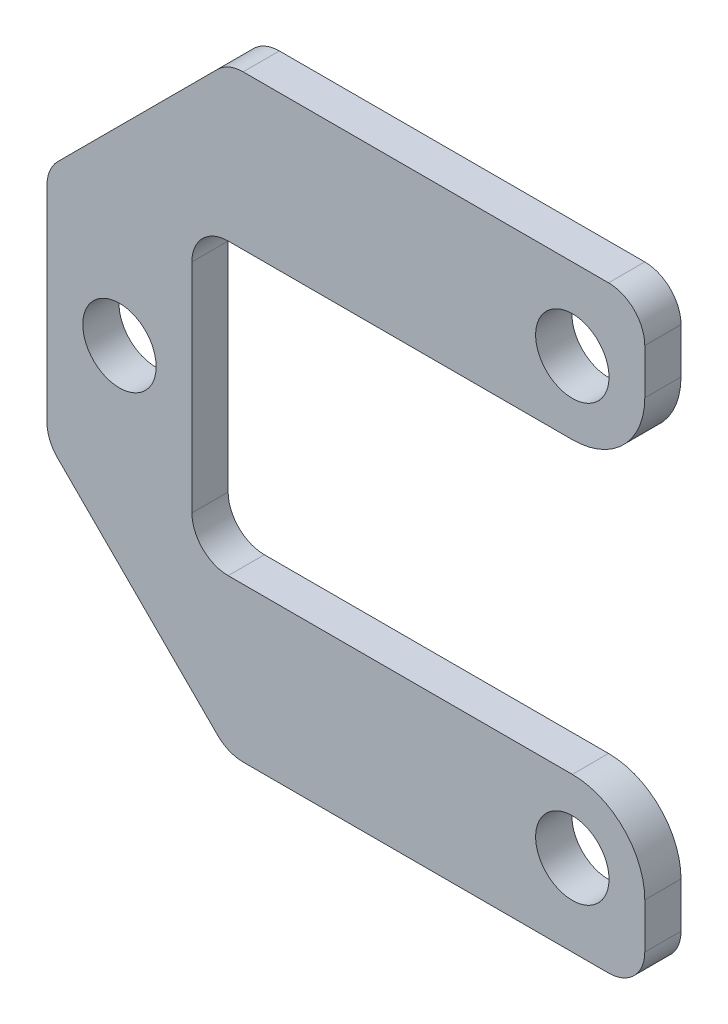
ISO-10303-21;
HEADER;
FILE_DESCRIPTION(('STEP AP214'),'2;1');
FILE_NAME('part.step','',(''),(''),'','','');
FILE_SCHEMA(('AUTOMOTIVE_DESIGN { 1 0 10303 214 1 1 1 1 }'));
ENDSEC;
DATA;
#1=APPLICATION_CONTEXT('core data for automotive mechanical design processes');
#2=APPLICATION_PROTOCOL_DEFINITION('international standard','automotive_design',2000,#1);
#3=PRODUCT_CONTEXT('',#1,'mechanical');
#4=PRODUCT('Part','Part','',(#3));
#5=PRODUCT_RELATED_PRODUCT_CATEGORY('part','',(#4));
#6=PRODUCT_DEFINITION_FORMATION('','',#4);
#7=PRODUCT_DEFINITION_CONTEXT('part definition',#1,'design');
#8=PRODUCT_DEFINITION('design','',#6,#7);
#9=PRODUCT_DEFINITION_SHAPE('','',#8);
#10=(LENGTH_UNIT() NAMED_UNIT(*) SI_UNIT(.MILLI.,.METRE.));
#11=(NAMED_UNIT(*) PLANE_ANGLE_UNIT() SI_UNIT($,.RADIAN.));
#12=(NAMED_UNIT(*) SI_UNIT($,.STERADIAN.) SOLID_ANGLE_UNIT());
#13=UNCERTAINTY_MEASURE_WITH_UNIT(LENGTH_MEASURE(1.E-05),#10,'distance_accuracy_value','');
#14=(GEOMETRIC_REPRESENTATION_CONTEXT(3) GLOBAL_UNCERTAINTY_ASSIGNED_CONTEXT((#13)) GLOBAL_UNIT_ASSIGNED_CONTEXT((#10,
#11,#12)) REPRESENTATION_CONTEXT('',''));
#15=CARTESIAN_POINT('',(0.,0.,0.));
#16=DIRECTION('',(0.,0.,1.));
#17=DIRECTION('',(1.,0.,0.));
#18=AXIS2_PLACEMENT_3D('',#15,#16,#17);
#19=CARTESIAN_POINT('',(19.,-16.5,2.));
#20=DIRECTION('',(-1.,0.,0.));
#21=DIRECTION('',(0.,0.,1.));
#22=AXIS2_PLACEMENT_3D('',#19,#20,#21);
#23=PLANE('',#22);
#24=DIRECTION('',(0.,1.,0.));
#25=VECTOR('',#24,1.);
#26=CARTESIAN_POINT('',(19.,-16.5,0.));
#27=LINE('',#26,#25);
#28=CARTESIAN_POINT('',(19.,-14.5,0.));
#29=VERTEX_POINT('',#28);
#30=CARTESIAN_POINT('',(19.,-12.,0.));
#31=VERTEX_POINT('',#30);
#32=EDGE_CURVE('E196',#29,#31,#27,.T.);
#33=ORIENTED_EDGE('',*,*,#32,.T.);
#34=DIRECTION('',(0.,0.,1.));
#35=VECTOR('',#34,1.);
#36=CARTESIAN_POINT('',(19.,-12.,2.));
#37=LINE('',#36,#35);
#38=CARTESIAN_POINT('',(19.,-12.,2.));
#39=VERTEX_POINT('',#38);
#40=EDGE_CURVE('E200',#31,#39,#37,.T.);
#41=ORIENTED_EDGE('',*,*,#40,.T.);
#42=DIRECTION('',(0.,1.,0.));
#43=VECTOR('',#42,1.);
#44=CARTESIAN_POINT('',(19.,-16.5,2.));
#45=LINE('',#44,#43);
#46=CARTESIAN_POINT('',(19.,-14.5,2.));
#47=VERTEX_POINT('',#46);
#48=EDGE_CURVE('E199',#47,#39,#45,.T.);
#49=ORIENTED_EDGE('',*,*,#48,.F.);
#50=DIRECTION('',(0.,0.,-1.));
#51=VECTOR('',#50,1.);
#52=CARTESIAN_POINT('',(19.,-14.5,2.));
#53=LINE('',#52,#51);
#54=EDGE_CURVE('E183',#47,#29,#53,.T.);
#55=ORIENTED_EDGE('',*,*,#54,.T.);
#56=EDGE_LOOP('',(#33,#41,#49,#55));
#57=FACE_BOUND('',#56,.T.);
#58=ADVANCED_FACE('F39',(#57),#23,.F.);
#59=CARTESIAN_POINT('',(19.,12.,2.));
#60=VERTEX_POINT('',#59);
#61=CARTESIAN_POINT('',(19.,14.5,2.));
#62=VERTEX_POINT('',#61);
#63=EDGE_CURVE('E221',#60,#62,#45,.T.);
#64=ORIENTED_EDGE('',*,*,#63,.F.);
#65=DIRECTION('',(0.,0.,-1.));
#66=VECTOR('',#65,1.);
#67=CARTESIAN_POINT('',(19.,12.,2.));
#68=LINE('',#67,#66);
#69=CARTESIAN_POINT('',(19.,12.,0.));
#70=VERTEX_POINT('',#69);
#71=EDGE_CURVE('E243',#60,#70,#68,.T.);
#72=ORIENTED_EDGE('',*,*,#71,.T.);
#73=CARTESIAN_POINT('',(19.,14.5,0.));
#74=VERTEX_POINT('',#73);
#75=EDGE_CURVE('E209',#70,#74,#27,.T.);
#76=ORIENTED_EDGE('',*,*,#75,.T.);
#77=DIRECTION('',(0.,0.,-1.));
#78=VECTOR('',#77,1.);
#79=CARTESIAN_POINT('',(19.,14.5,2.));
#80=LINE('',#79,#78);
#81=EDGE_CURVE('E241',#74,#62,#80,.F.);
#82=ORIENTED_EDGE('',*,*,#81,.T.);
#83=EDGE_LOOP('',(#64,#72,#76,#82));
#84=FACE_BOUND('',#83,.T.);
#85=ADVANCED_FACE('F384',(#84),#23,.F.);
#86=CARTESIAN_POINT('',(-19.,16.5,2.));
#87=DIRECTION('',(0.,-1.,0.));
#88=DIRECTION('',(0.,0.,-1.));
#89=AXIS2_PLACEMENT_3D('',#86,#87,#88);
#90=PLANE('',#89);
#91=DIRECTION('',(-1.,0.,0.));
#92=VECTOR('',#91,1.);
#93=CARTESIAN_POINT('',(-19.,16.5,0.));
#94=LINE('',#93,#92);
#95=CARTESIAN_POINT('',(17.,16.5,0.));
#96=VERTEX_POINT('',#95);
#97=CARTESIAN_POINT('',(-3.17157287525377,16.5,0.));
#98=VERTEX_POINT('',#97);
#99=EDGE_CURVE('E208',#96,#98,#94,.T.);
#100=ORIENTED_EDGE('',*,*,#99,.T.);
#101=DIRECTION('',(0.,0.,-1.));
#102=VECTOR('',#101,1.);
#103=CARTESIAN_POINT('',(-3.17157287525377,16.5,2.));
#104=LINE('',#103,#102);
#105=CARTESIAN_POINT('',(-3.17157287525377,16.5,2.));
#106=VERTEX_POINT('',#105);
#107=EDGE_CURVE('E304',#98,#106,#104,.F.);
#108=ORIENTED_EDGE('',*,*,#107,.T.);
#109=DIRECTION('',(-1.,0.,0.));
#110=VECTOR('',#109,1.);
#111=CARTESIAN_POINT('',(-19.,16.5,2.));
#112=LINE('',#111,#110);
#113=CARTESIAN_POINT('',(17.,16.5,2.));
#114=VERTEX_POINT('',#113);
#115=EDGE_CURVE('E358',#114,#106,#112,.T.);
#116=ORIENTED_EDGE('',*,*,#115,.F.);
#117=DIRECTION('',(0.,0.,-1.));
#118=VECTOR('',#117,1.);
#119=CARTESIAN_POINT('',(17.,16.5,2.));
#120=LINE('',#119,#118);
#121=EDGE_CURVE('E250',#114,#96,#120,.T.);
#122=ORIENTED_EDGE('',*,*,#121,.T.);
#123=EDGE_LOOP('',(#100,#108,#116,#122));
#124=FACE_BOUND('',#123,.T.);
#125=ADVANCED_FACE('F390',(#124),#90,.F.);
#126=CARTESIAN_POINT('',(-19.,-16.5,2.));
#127=DIRECTION('',(0.,1.,0.));
#128=DIRECTION('',(0.,0.,1.));
#129=AXIS2_PLACEMENT_3D('',#126,#127,#128);
#130=PLANE('',#129);
#131=DIRECTION('',(1.,0.,0.));
#132=VECTOR('',#131,1.);
#133=CARTESIAN_POINT('',(-19.,-16.5,2.));
#134=LINE('',#133,#132);
#135=CARTESIAN_POINT('',(-3.17157287525372,-16.5,2.));
#136=VERTEX_POINT('',#135);
#137=CARTESIAN_POINT('',(17.,-16.5,2.));
#138=VERTEX_POINT('',#137);
#139=EDGE_CURVE('E217',#136,#138,#134,.T.);
#140=ORIENTED_EDGE('',*,*,#139,.F.);
#141=DIRECTION('',(0.,0.,1.));
#142=VECTOR('',#141,1.);
#143=CARTESIAN_POINT('',(-3.17157287525372,-16.5,0.));
#144=LINE('',#143,#142);
#145=CARTESIAN_POINT('',(-3.17157287525372,-16.5,0.));
#146=VERTEX_POINT('',#145);
#147=EDGE_CURVE('E278',#136,#146,#144,.F.);
#148=ORIENTED_EDGE('',*,*,#147,.T.);
#149=DIRECTION('',(1.,0.,0.));
#150=VECTOR('',#149,1.);
#151=CARTESIAN_POINT('',(-19.,-16.5,0.));
#152=LINE('',#151,#150);
#153=CARTESIAN_POINT('',(17.,-16.5,0.));
#154=VERTEX_POINT('',#153);
#155=EDGE_CURVE('E212',#146,#154,#152,.T.);
#156=ORIENTED_EDGE('',*,*,#155,.T.);
#157=DIRECTION('',(0.,0.,-1.));
#158=VECTOR('',#157,1.);
#159=CARTESIAN_POINT('',(17.,-16.5,2.));
#160=LINE('',#159,#158);
#161=EDGE_CURVE('E185',#154,#138,#160,.F.);
#162=ORIENTED_EDGE('',*,*,#161,.T.);
#163=EDGE_LOOP('',(#140,#148,#156,#162));
#164=FACE_BOUND('',#163,.T.);
#165=ADVANCED_FACE('F365',(#164),#130,.F.);
#166=CARTESIAN_POINT('',(0.,0.,2.));
#167=DIRECTION('',(0.,0.,-1.));
#168=DIRECTION('',(-1.,0.,0.));
#169=AXIS2_PLACEMENT_3D('',#166,#167,#168);
#170=PLANE('',#169);
#171=CARTESIAN_POINT('',(-9.99999999999996,0.,2.));
#172=DIRECTION('',(0.,0.,1.));
#173=DIRECTION('',(1.,0.,0.));
#174=AXIS2_PLACEMENT_3D('',#171,#172,#173);
#175=CIRCLE('',#174,2.025);
#176=CARTESIAN_POINT('',(-7.97499999999996,0.,2.));
#177=VERTEX_POINT('',#176);
#178=EDGE_CURVE('E343',#177,#177,#175,.T.);
#179=ORIENTED_EDGE('',*,*,#178,.F.);
#180=EDGE_LOOP('',(#179));
#181=FACE_BOUND('',#180,.T.);
#182=CARTESIAN_POINT('',(15.,-12.,2.));
#183=DIRECTION('',(0.,0.,1.));
#184=DIRECTION('',(1.,0.,0.));
#185=AXIS2_PLACEMENT_3D('',#182,#183,#184);
#186=CIRCLE('',#185,2.025);
#187=CARTESIAN_POINT('',(17.025,-12.,2.));
#188=VERTEX_POINT('',#187);
#189=EDGE_CURVE('E349',#188,#188,#186,.T.);
#190=ORIENTED_EDGE('',*,*,#189,.F.);
#191=EDGE_LOOP('',(#190));
#192=FACE_BOUND('',#191,.T.);
#193=CARTESIAN_POINT('',(15.,12.,2.));
#194=DIRECTION('',(0.,0.,1.));
#195=DIRECTION('',(1.,0.,0.));
#196=AXIS2_PLACEMENT_3D('',#193,#194,#195);
#197=CIRCLE('',#196,2.025);
#198=CARTESIAN_POINT('',(17.025,12.,2.));
#199=VERTEX_POINT('',#198);
#200=EDGE_CURVE('E335',#199,#199,#197,.T.);
#201=ORIENTED_EDGE('',*,*,#200,.F.);
#202=EDGE_LOOP('',(#201));
#203=FACE_BOUND('',#202,.T.);
#204=DIRECTION('',(-0.707106781186549,0.707106781186546,0.));
#205=VECTOR('',#204,1.);
#206=CARTESIAN_POINT('',(-14.,-6.49999999999996,2.));
#207=LINE('',#206,#205);
#208=CARTESIAN_POINT('',(-13.414213562373,-7.08578643762686,2.));
#209=VERTEX_POINT('',#208);
#210=CARTESIAN_POINT('',(-4.58578643762681,-15.9142135623731,2.));
#211=VERTEX_POINT('',#210);
#212=EDGE_CURVE('E267',#209,#211,#207,.F.);
#213=ORIENTED_EDGE('',*,*,#212,.T.);
#214=CARTESIAN_POINT('',(-3.17157287525372,-14.5,2.));
#215=DIRECTION('',(0.,0.,-1.));
#216=DIRECTION('',(-1.,0.,0.));
#217=AXIS2_PLACEMENT_3D('',#214,#215,#216);
#218=CIRCLE('',#217,2.);
#219=EDGE_CURVE('E297',#211,#136,#218,.F.);
#220=ORIENTED_EDGE('',*,*,#219,.T.);
#221=ORIENTED_EDGE('',*,*,#139,.T.);
#222=CARTESIAN_POINT('',(17.,-14.5,2.));
#223=DIRECTION('',(0.,0.,-1.));
#224=DIRECTION('',(-1.,0.,0.));
#225=AXIS2_PLACEMENT_3D('',#222,#223,#224);
#226=CIRCLE('',#225,2.);
#227=EDGE_CURVE('E225',#138,#47,#226,.F.);
#228=ORIENTED_EDGE('',*,*,#227,.T.);
#229=ORIENTED_EDGE('',*,*,#48,.T.);
#230=CARTESIAN_POINT('',(15.,-12.,2.));
#231=DIRECTION('',(0.,0.,-1.));
#232=DIRECTION('',(-1.,0.,0.));
#233=AXIS2_PLACEMENT_3D('',#230,#231,#232);
#234=CIRCLE('',#233,4.);
#235=CARTESIAN_POINT('',(15.,-7.99999999999999,2.));
#236=VERTEX_POINT('',#235);
#237=EDGE_CURVE('E231',#39,#236,#234,.F.);
#238=ORIENTED_EDGE('',*,*,#237,.T.);
#239=DIRECTION('',(1.,0.,0.));
#240=VECTOR('',#239,1.);
#241=CARTESIAN_POINT('',(-5.99999999999996,-7.99999999999999,2.));
#242=LINE('',#241,#240);
#243=CARTESIAN_POINT('',(-3.99999999999996,-7.99999999999999,2.));
#244=VERTEX_POINT('',#243);
#245=EDGE_CURVE('E334',#244,#236,#242,.T.);
#246=ORIENTED_EDGE('',*,*,#245,.F.);
#247=CARTESIAN_POINT('',(-3.99999999999996,-5.99999999999999,2.));
#248=DIRECTION('',(0.,0.,-1.));
#249=DIRECTION('',(-1.,0.,0.));
#250=AXIS2_PLACEMENT_3D('',#247,#248,#249);
#251=CIRCLE('',#250,2.);
#252=CARTESIAN_POINT('',(-5.99999999999996,-5.99999999999999,2.));
#253=VERTEX_POINT('',#252);
#254=EDGE_CURVE('E263',#244,#253,#251,.T.);
#255=ORIENTED_EDGE('',*,*,#254,.T.);
#256=DIRECTION('',(0.,-1.,0.));
#257=VECTOR('',#256,1.);
#258=CARTESIAN_POINT('',(-5.99999999999996,-7.99999999999999,2.));
#259=LINE('',#258,#257);
#260=CARTESIAN_POINT('',(-5.99999999999996,5.99999999999999,2.));
#261=VERTEX_POINT('',#260);
#262=EDGE_CURVE('E326',#261,#253,#259,.T.);
#263=ORIENTED_EDGE('',*,*,#262,.F.);
#264=CARTESIAN_POINT('',(-3.99999999999996,5.99999999999999,2.));
#265=DIRECTION('',(0.,0.,-1.));
#266=DIRECTION('',(-1.,0.,0.));
#267=AXIS2_PLACEMENT_3D('',#264,#265,#266);
#268=CIRCLE('',#267,2.);
#269=CARTESIAN_POINT('',(-3.99999999999996,7.99999999999999,2.));
#270=VERTEX_POINT('',#269);
#271=EDGE_CURVE('E259',#261,#270,#268,.T.);
#272=ORIENTED_EDGE('',*,*,#271,.T.);
#273=DIRECTION('',(-1.,0.,0.));
#274=VECTOR('',#273,1.);
#275=CARTESIAN_POINT('',(-5.99999999999996,7.99999999999999,2.));
#276=LINE('',#275,#274);
#277=CARTESIAN_POINT('',(15.,7.99999999999999,2.));
#278=VERTEX_POINT('',#277);
#279=EDGE_CURVE('E323',#278,#270,#276,.T.);
#280=ORIENTED_EDGE('',*,*,#279,.F.);
#281=CARTESIAN_POINT('',(15.,12.,2.));
#282=DIRECTION('',(0.,0.,-1.));
#283=DIRECTION('',(-1.,0.,0.));
#284=AXIS2_PLACEMENT_3D('',#281,#282,#283);
#285=CIRCLE('',#284,4.);
#286=EDGE_CURVE('E229',#278,#60,#285,.F.);
#287=ORIENTED_EDGE('',*,*,#286,.T.);
#288=ORIENTED_EDGE('',*,*,#63,.T.);
#289=CARTESIAN_POINT('',(17.,14.5,2.));
#290=DIRECTION('',(0.,0.,-1.));
#291=DIRECTION('',(-1.,0.,0.));
#292=AXIS2_PLACEMENT_3D('',#289,#290,#291);
#293=CIRCLE('',#292,2.);
#294=EDGE_CURVE('E227',#62,#114,#293,.F.);
#295=ORIENTED_EDGE('',*,*,#294,.T.);
#296=ORIENTED_EDGE('',*,*,#115,.T.);
#297=CARTESIAN_POINT('',(-3.17157287525377,14.5,2.));
#298=DIRECTION('',(0.,0.,-1.));
#299=DIRECTION('',(-1.,0.,0.));
#300=AXIS2_PLACEMENT_3D('',#297,#298,#299);
#301=CIRCLE('',#300,2.);
#302=CARTESIAN_POINT('',(-4.58578643762687,15.9142135623731,2.));
#303=VERTEX_POINT('',#302);
#304=EDGE_CURVE('E294',#106,#303,#301,.F.);
#305=ORIENTED_EDGE('',*,*,#304,.T.);
#306=DIRECTION('',(0.707106781186546,0.707106781186549,0.));
#307=VECTOR('',#306,1.);
#308=CARTESIAN_POINT('',(-3.99999999999997,16.5,2.));
#309=LINE('',#308,#307);
#310=CARTESIAN_POINT('',(-13.4142135623731,7.08578643762689,2.));
#311=VERTEX_POINT('',#310);
#312=EDGE_CURVE('E270',#303,#311,#309,.F.);
#313=ORIENTED_EDGE('',*,*,#312,.T.);
#314=CARTESIAN_POINT('',(-12.,5.6715728752538,2.));
#315=DIRECTION('',(0.,0.,-1.));
#316=DIRECTION('',(-1.,0.,0.));
#317=AXIS2_PLACEMENT_3D('',#314,#315,#316);
#318=CIRCLE('',#317,2.);
#319=CARTESIAN_POINT('',(-14.,5.6715728752538,2.));
#320=VERTEX_POINT('',#319);
#321=EDGE_CURVE('E54',#311,#320,#318,.F.);
#322=ORIENTED_EDGE('',*,*,#321,.T.);
#323=DIRECTION('',(0.,1.,0.));
#324=VECTOR('',#323,1.);
#325=CARTESIAN_POINT('',(-14.,16.5,2.));
#326=LINE('',#325,#324);
#327=CARTESIAN_POINT('',(-14.,-5.67157287525377,2.));
#328=VERTEX_POINT('',#327);
#329=EDGE_CURVE('E321',#328,#320,#326,.T.);
#330=ORIENTED_EDGE('',*,*,#329,.F.);
#331=CARTESIAN_POINT('',(-12.,-5.67157287525377,2.));
#332=DIRECTION('',(0.,0.,-1.));
#333=DIRECTION('',(-1.,0.,0.));
#334=AXIS2_PLACEMENT_3D('',#331,#332,#333);
#335=CIRCLE('',#334,2.);
#336=EDGE_CURVE('E62',#328,#209,#335,.F.);
#337=ORIENTED_EDGE('',*,*,#336,.T.);
#338=EDGE_LOOP('',(#213,#220,#221,#228,#229,#238,#246,#255,#263,#272,#280,#287,#288,#295,#296,
#305,#313,#322,#330,#337));
#339=FACE_BOUND('',#338,.T.);
#340=ADVANCED_FACE('F313',(#181,#192,#203,#339),#170,.F.);
#341=CARTESIAN_POINT('',(0.,0.,0.));
#342=DIRECTION('',(0.,0.,-1.));
#343=DIRECTION('',(-1.,0.,0.));
#344=AXIS2_PLACEMENT_3D('',#341,#342,#343);
#345=PLANE('',#344);
#346=ORIENTED_EDGE('',*,*,#155,.F.);
#347=CARTESIAN_POINT('',(-3.17157287525372,-14.5,0.));
#348=DIRECTION('',(0.,0.,-1.));
#349=DIRECTION('',(-1.,0.,0.));
#350=AXIS2_PLACEMENT_3D('',#347,#348,#349);
#351=CIRCLE('',#350,2.);
#352=CARTESIAN_POINT('',(-4.58578643762681,-15.9142135623731,0.));
#353=VERTEX_POINT('',#352);
#354=EDGE_CURVE('E287',#146,#353,#351,.T.);
#355=ORIENTED_EDGE('',*,*,#354,.T.);
#356=DIRECTION('',(0.707106781186549,-0.707106781186546,0.));
#357=VECTOR('',#356,1.);
#358=CARTESIAN_POINT('',(-10.2499999999999,-10.25,0.));
#359=LINE('',#358,#357);
#360=CARTESIAN_POINT('',(-13.414213562373,-7.08578643762687,0.));
#361=VERTEX_POINT('',#360);
#362=EDGE_CURVE('E272',#353,#361,#359,.F.);
#363=ORIENTED_EDGE('',*,*,#362,.T.);
#364=CARTESIAN_POINT('',(-12.,-5.67157287525377,0.));
#365=DIRECTION('',(0.,0.,-1.));
#366=DIRECTION('',(-1.,0.,0.));
#367=AXIS2_PLACEMENT_3D('',#364,#365,#366);
#368=CIRCLE('',#367,2.);
#369=CARTESIAN_POINT('',(-14.,-5.67157287525377,0.));
#370=VERTEX_POINT('',#369);
#371=EDGE_CURVE('E285',#361,#370,#368,.T.);
#372=ORIENTED_EDGE('',*,*,#371,.T.);
#373=DIRECTION('',(0.,1.,0.));
#374=VECTOR('',#373,1.);
#375=CARTESIAN_POINT('',(-14.,16.5,0.));
#376=LINE('',#375,#374);
#377=CARTESIAN_POINT('',(-14.,5.6715728752538,0.));
#378=VERTEX_POINT('',#377);
#379=EDGE_CURVE('E320',#370,#378,#376,.T.);
#380=ORIENTED_EDGE('',*,*,#379,.T.);
#381=CARTESIAN_POINT('',(-12.,5.6715728752538,0.));
#382=DIRECTION('',(0.,0.,-1.));
#383=DIRECTION('',(-1.,0.,0.));
#384=AXIS2_PLACEMENT_3D('',#381,#382,#383);
#385=CIRCLE('',#384,2.);
#386=CARTESIAN_POINT('',(-13.4142135623731,7.0857864376269,0.));
#387=VERTEX_POINT('',#386);
#388=EDGE_CURVE('E281',#378,#387,#385,.T.);
#389=ORIENTED_EDGE('',*,*,#388,.T.);
#390=DIRECTION('',(-0.707106781186546,-0.707106781186549,0.));
#391=VECTOR('',#390,1.);
#392=CARTESIAN_POINT('',(-10.25,10.25,0.));
#393=LINE('',#392,#391);
#394=CARTESIAN_POINT('',(-4.58578643762687,15.9142135623731,0.));
#395=VERTEX_POINT('',#394);
#396=EDGE_CURVE('E275',#387,#395,#393,.F.);
#397=ORIENTED_EDGE('',*,*,#396,.T.);
#398=CARTESIAN_POINT('',(-3.17157287525377,14.5,0.));
#399=DIRECTION('',(0.,0.,-1.));
#400=DIRECTION('',(-1.,0.,0.));
#401=AXIS2_PLACEMENT_3D('',#398,#399,#400);
#402=CIRCLE('',#401,2.);
#403=EDGE_CURVE('E283',#395,#98,#402,.T.);
#404=ORIENTED_EDGE('',*,*,#403,.T.);
#405=ORIENTED_EDGE('',*,*,#99,.F.);
#406=CARTESIAN_POINT('',(17.,14.5,0.));
#407=DIRECTION('',(0.,0.,-1.));
#408=DIRECTION('',(-1.,0.,0.));
#409=AXIS2_PLACEMENT_3D('',#406,#407,#408);
#410=CIRCLE('',#409,2.);
#411=EDGE_CURVE('E189',#96,#74,#410,.T.);
#412=ORIENTED_EDGE('',*,*,#411,.T.);
#413=ORIENTED_EDGE('',*,*,#75,.F.);
#414=CARTESIAN_POINT('',(15.,12.,0.));
#415=DIRECTION('',(0.,0.,-1.));
#416=DIRECTION('',(-1.,0.,0.));
#417=AXIS2_PLACEMENT_3D('',#414,#415,#416);
#418=CIRCLE('',#417,4.);
#419=CARTESIAN_POINT('',(15.,7.99999999999999,0.));
#420=VERTEX_POINT('',#419);
#421=EDGE_CURVE('E238',#70,#420,#418,.T.);
#422=ORIENTED_EDGE('',*,*,#421,.T.);
#423=DIRECTION('',(1.,0.,0.));
#424=VECTOR('',#423,1.);
#425=CARTESIAN_POINT('',(0.,7.99999999999999,0.));
#426=LINE('',#425,#424);
#427=CARTESIAN_POINT('',(-3.99999999999996,7.99999999999999,0.));
#428=VERTEX_POINT('',#427);
#429=EDGE_CURVE('E201',#428,#420,#426,.T.);
#430=ORIENTED_EDGE('',*,*,#429,.F.);
#431=CARTESIAN_POINT('',(-3.99999999999996,5.99999999999999,0.));
#432=DIRECTION('',(0.,0.,-1.));
#433=DIRECTION('',(-1.,0.,0.));
#434=AXIS2_PLACEMENT_3D('',#431,#432,#433);
#435=CIRCLE('',#434,2.);
#436=CARTESIAN_POINT('',(-5.99999999999996,5.99999999999999,0.));
#437=VERTEX_POINT('',#436);
#438=EDGE_CURVE('E261',#428,#437,#435,.F.);
#439=ORIENTED_EDGE('',*,*,#438,.T.);
#440=DIRECTION('',(0.,-1.,0.));
#441=VECTOR('',#440,1.);
#442=CARTESIAN_POINT('',(-5.99999999999996,-7.99999999999999,0.));
#443=LINE('',#442,#441);
#444=CARTESIAN_POINT('',(-5.99999999999996,-5.99999999999999,0.));
#445=VERTEX_POINT('',#444);
#446=EDGE_CURVE('E330',#437,#445,#443,.T.);
#447=ORIENTED_EDGE('',*,*,#446,.T.);
#448=CARTESIAN_POINT('',(-3.99999999999996,-5.99999999999999,0.));
#449=DIRECTION('',(0.,0.,-1.));
#450=DIRECTION('',(-1.,0.,0.));
#451=AXIS2_PLACEMENT_3D('',#448,#449,#450);
#452=CIRCLE('',#451,2.);
#453=CARTESIAN_POINT('',(-3.99999999999996,-7.99999999999999,0.));
#454=VERTEX_POINT('',#453);
#455=EDGE_CURVE('E265',#445,#454,#452,.F.);
#456=ORIENTED_EDGE('',*,*,#455,.T.);
#457=DIRECTION('',(1.,0.,0.));
#458=VECTOR('',#457,1.);
#459=CARTESIAN_POINT('',(-5.99999999999996,-7.99999999999999,0.));
#460=LINE('',#459,#458);
#461=CARTESIAN_POINT('',(15.,-7.99999999999999,0.));
#462=VERTEX_POINT('',#461);
#463=EDGE_CURVE('E333',#454,#462,#460,.T.);
#464=ORIENTED_EDGE('',*,*,#463,.T.);
#465=CARTESIAN_POINT('',(15.,-12.,0.));
#466=DIRECTION('',(0.,0.,-1.));
#467=DIRECTION('',(-1.,0.,0.));
#468=AXIS2_PLACEMENT_3D('',#465,#466,#467);
#469=CIRCLE('',#468,4.);
#470=EDGE_CURVE('E207',#462,#31,#469,.T.);
#471=ORIENTED_EDGE('',*,*,#470,.T.);
#472=ORIENTED_EDGE('',*,*,#32,.F.);
#473=CARTESIAN_POINT('',(17.,-14.5,0.));
#474=DIRECTION('',(0.,0.,-1.));
#475=DIRECTION('',(-1.,0.,0.));
#476=AXIS2_PLACEMENT_3D('',#473,#474,#475);
#477=CIRCLE('',#476,2.);
#478=EDGE_CURVE('E179',#29,#154,#477,.T.);
#479=ORIENTED_EDGE('',*,*,#478,.T.);
#480=EDGE_LOOP('',(#346,#355,#363,#372,#380,#389,#397,#404,#405,#412,#413,#422,#430,#439,#447,
#456,#464,#471,#472,#479));
#481=FACE_BOUND('',#480,.T.);
#482=CARTESIAN_POINT('',(-9.99999999999996,0.,0.));
#483=DIRECTION('',(0.,0.,1.));
#484=DIRECTION('',(1.,0.,0.));
#485=AXIS2_PLACEMENT_3D('',#482,#483,#484);
#486=CIRCLE('',#485,2.025);
#487=CARTESIAN_POINT('',(-7.97499999999996,0.,0.));
#488=VERTEX_POINT('',#487);
#489=EDGE_CURVE('E215',#488,#488,#486,.T.);
#490=ORIENTED_EDGE('',*,*,#489,.T.);
#491=EDGE_LOOP('',(#490));
#492=FACE_BOUND('',#491,.T.);
#493=CARTESIAN_POINT('',(15.,-12.,0.));
#494=DIRECTION('',(0.,0.,1.));
#495=DIRECTION('',(1.,0.,0.));
#496=AXIS2_PLACEMENT_3D('',#493,#494,#495);
#497=CIRCLE('',#496,2.025);
#498=CARTESIAN_POINT('',(17.025,-12.,0.));
#499=VERTEX_POINT('',#498);
#500=EDGE_CURVE('E346',#499,#499,#497,.T.);
#501=ORIENTED_EDGE('',*,*,#500,.T.);
#502=EDGE_LOOP('',(#501));
#503=FACE_BOUND('',#502,.T.);
#504=CARTESIAN_POINT('',(15.,12.,0.));
#505=DIRECTION('',(0.,0.,1.));
#506=DIRECTION('',(1.,0.,0.));
#507=AXIS2_PLACEMENT_3D('',#504,#505,#506);
#508=CIRCLE('',#507,2.025);
#509=CARTESIAN_POINT('',(17.025,12.,0.));
#510=VERTEX_POINT('',#509);
#511=EDGE_CURVE('E352',#510,#510,#508,.T.);
#512=ORIENTED_EDGE('',*,*,#511,.T.);
#513=EDGE_LOOP('',(#512));
#514=FACE_BOUND('',#513,.T.);
#515=ADVANCED_FACE('F203',(#481,#492,#503,#514),#345,.T.);
#516=CARTESIAN_POINT('',(15.,12.,0.));
#517=DIRECTION('',(0.,0.,1.));
#518=DIRECTION('',(1.,0.,0.));
#519=AXIS2_PLACEMENT_3D('',#516,#517,#518);
#520=CYLINDRICAL_SURFACE('',#519,2.025);
#521=ORIENTED_EDGE('',*,*,#511,.F.);
#522=EDGE_LOOP('',(#521));
#523=FACE_BOUND('',#522,.T.);
#524=ORIENTED_EDGE('',*,*,#200,.T.);
#525=EDGE_LOOP('',(#524));
#526=FACE_BOUND('',#525,.T.);
#527=ADVANCED_FACE('F450',(#523,#526),#520,.F.);
#528=CARTESIAN_POINT('',(15.,-12.,0.));
#529=DIRECTION('',(0.,0.,1.));
#530=DIRECTION('',(1.,0.,0.));
#531=AXIS2_PLACEMENT_3D('',#528,#529,#530);
#532=CYLINDRICAL_SURFACE('',#531,2.025);
#533=ORIENTED_EDGE('',*,*,#500,.F.);
#534=EDGE_LOOP('',(#533));
#535=FACE_BOUND('',#534,.T.);
#536=ORIENTED_EDGE('',*,*,#189,.T.);
#537=EDGE_LOOP('',(#536));
#538=FACE_BOUND('',#537,.T.);
#539=ADVANCED_FACE('F446',(#535,#538),#532,.F.);
#540=CARTESIAN_POINT('',(-9.99999999999996,0.,0.));
#541=DIRECTION('',(0.,0.,1.));
#542=DIRECTION('',(1.,0.,0.));
#543=AXIS2_PLACEMENT_3D('',#540,#541,#542);
#544=CYLINDRICAL_SURFACE('',#543,2.025);
#545=ORIENTED_EDGE('',*,*,#489,.F.);
#546=EDGE_LOOP('',(#545));
#547=FACE_BOUND('',#546,.T.);
#548=ORIENTED_EDGE('',*,*,#178,.T.);
#549=EDGE_LOOP('',(#548));
#550=FACE_BOUND('',#549,.T.);
#551=ADVANCED_FACE('F436',(#547,#550),#544,.F.);
#552=CARTESIAN_POINT('',(-5.99999999999996,-7.99999999999999,0.));
#553=DIRECTION('',(0.,-1.,0.));
#554=DIRECTION('',(0.,0.,-1.));
#555=AXIS2_PLACEMENT_3D('',#552,#553,#554);
#556=PLANE('',#555);
#557=ORIENTED_EDGE('',*,*,#245,.T.);
#558=DIRECTION('',(0.,0.,1.));
#559=VECTOR('',#558,1.);
#560=CARTESIAN_POINT('',(15.,-7.99999999999999,0.));
#561=LINE('',#560,#559);
#562=EDGE_CURVE('E190',#236,#462,#561,.F.);
#563=ORIENTED_EDGE('',*,*,#562,.T.);
#564=ORIENTED_EDGE('',*,*,#463,.F.);
#565=DIRECTION('',(0.,0.,1.));
#566=VECTOR('',#565,1.);
#567=CARTESIAN_POINT('',(-3.99999999999996,-7.99999999999999,2.));
#568=LINE('',#567,#566);
#569=EDGE_CURVE('E233',#454,#244,#568,.T.);
#570=ORIENTED_EDGE('',*,*,#569,.T.);
#571=EDGE_LOOP('',(#557,#563,#564,#570));
#572=FACE_BOUND('',#571,.T.);
#573=ADVANCED_FACE('F432',(#572),#556,.F.);
#574=CARTESIAN_POINT('',(-5.99999999999996,7.99999999999999,0.));
#575=DIRECTION('',(0.,1.,0.));
#576=DIRECTION('',(0.,0.,1.));
#577=AXIS2_PLACEMENT_3D('',#574,#575,#576);
#578=PLANE('',#577);
#579=ORIENTED_EDGE('',*,*,#429,.T.);
#580=DIRECTION('',(0.,0.,-1.));
#581=VECTOR('',#580,1.);
#582=CARTESIAN_POINT('',(15.,7.99999999999999,0.));
#583=LINE('',#582,#581);
#584=EDGE_CURVE('E248',#420,#278,#583,.F.);
#585=ORIENTED_EDGE('',*,*,#584,.T.);
#586=ORIENTED_EDGE('',*,*,#279,.T.);
#587=DIRECTION('',(0.,0.,1.));
#588=VECTOR('',#587,1.);
#589=CARTESIAN_POINT('',(-3.99999999999996,7.99999999999999,0.));
#590=LINE('',#589,#588);
#591=EDGE_CURVE('E246',#270,#428,#590,.F.);
#592=ORIENTED_EDGE('',*,*,#591,.T.);
#593=EDGE_LOOP('',(#579,#585,#586,#592));
#594=FACE_BOUND('',#593,.T.);
#595=ADVANCED_FACE('F435',(#594),#578,.F.);
#596=CARTESIAN_POINT('',(-5.99999999999996,-7.99999999999999,0.));
#597=DIRECTION('',(-1.,0.,0.));
#598=DIRECTION('',(0.,0.,1.));
#599=AXIS2_PLACEMENT_3D('',#596,#597,#598);
#600=PLANE('',#599);
#601=ORIENTED_EDGE('',*,*,#446,.F.);
#602=DIRECTION('',(0.,0.,1.));
#603=VECTOR('',#602,1.);
#604=CARTESIAN_POINT('',(-5.99999999999996,5.99999999999999,2.));
#605=LINE('',#604,#603);
#606=EDGE_CURVE('E256',#437,#261,#605,.T.);
#607=ORIENTED_EDGE('',*,*,#606,.T.);
#608=ORIENTED_EDGE('',*,*,#262,.T.);
#609=DIRECTION('',(0.,0.,1.));
#610=VECTOR('',#609,1.);
#611=CARTESIAN_POINT('',(-5.99999999999996,-5.99999999999999,0.));
#612=LINE('',#611,#610);
#613=EDGE_CURVE('E254',#253,#445,#612,.F.);
#614=ORIENTED_EDGE('',*,*,#613,.T.);
#615=EDGE_LOOP('',(#601,#607,#608,#614));
#616=FACE_BOUND('',#615,.T.);
#617=ADVANCED_FACE('F399',(#616),#600,.F.);
#618=CARTESIAN_POINT('',(15.,-12.,2.));
#619=DIRECTION('',(0.,0.,1.));
#620=DIRECTION('',(1.,0.,0.));
#621=AXIS2_PLACEMENT_3D('',#618,#619,#620);
#622=CYLINDRICAL_SURFACE('',#621,4.);
#623=ORIENTED_EDGE('',*,*,#470,.F.);
#624=ORIENTED_EDGE('',*,*,#562,.F.);
#625=ORIENTED_EDGE('',*,*,#237,.F.);
#626=ORIENTED_EDGE('',*,*,#40,.F.);
#627=EDGE_LOOP('',(#623,#624,#625,#626));
#628=FACE_BOUND('',#627,.T.);
#629=ADVANCED_FACE('F395',(#628),#622,.T.);
#630=CARTESIAN_POINT('',(15.,12.,2.));
#631=DIRECTION('',(0.,0.,-1.));
#632=DIRECTION('',(-1.,0.,0.));
#633=AXIS2_PLACEMENT_3D('',#630,#631,#632);
#634=CYLINDRICAL_SURFACE('',#633,4.);
#635=ORIENTED_EDGE('',*,*,#286,.F.);
#636=ORIENTED_EDGE('',*,*,#584,.F.);
#637=ORIENTED_EDGE('',*,*,#421,.F.);
#638=ORIENTED_EDGE('',*,*,#71,.F.);
#639=EDGE_LOOP('',(#635,#636,#637,#638));
#640=FACE_BOUND('',#639,.T.);
#641=ADVANCED_FACE('F398',(#640),#634,.T.);
#642=CARTESIAN_POINT('',(17.,14.5,2.));
#643=DIRECTION('',(0.,0.,-1.));
#644=DIRECTION('',(-1.,0.,0.));
#645=AXIS2_PLACEMENT_3D('',#642,#643,#644);
#646=CYLINDRICAL_SURFACE('',#645,2.);
#647=ORIENTED_EDGE('',*,*,#294,.F.);
#648=ORIENTED_EDGE('',*,*,#81,.F.);
#649=ORIENTED_EDGE('',*,*,#411,.F.);
#650=ORIENTED_EDGE('',*,*,#121,.F.);
#651=EDGE_LOOP('',(#647,#648,#649,#650));
#652=FACE_BOUND('',#651,.T.);
#653=ADVANCED_FACE('F403',(#652),#646,.T.);
#654=CARTESIAN_POINT('',(17.,-14.5,2.));
#655=DIRECTION('',(0.,0.,-1.));
#656=DIRECTION('',(-1.,0.,0.));
#657=AXIS2_PLACEMENT_3D('',#654,#655,#656);
#658=CYLINDRICAL_SURFACE('',#657,2.);
#659=ORIENTED_EDGE('',*,*,#227,.F.);
#660=ORIENTED_EDGE('',*,*,#161,.F.);
#661=ORIENTED_EDGE('',*,*,#478,.F.);
#662=ORIENTED_EDGE('',*,*,#54,.F.);
#663=EDGE_LOOP('',(#659,#660,#661,#662));
#664=FACE_BOUND('',#663,.T.);
#665=ADVANCED_FACE('F182',(#664),#658,.T.);
#666=CARTESIAN_POINT('',(-3.99999999999996,5.99999999999999,0.));
#667=DIRECTION('',(0.,0.,-1.));
#668=DIRECTION('',(-1.,0.,0.));
#669=AXIS2_PLACEMENT_3D('',#666,#667,#668);
#670=CYLINDRICAL_SURFACE('',#669,2.);
#671=ORIENTED_EDGE('',*,*,#438,.F.);
#672=ORIENTED_EDGE('',*,*,#591,.F.);
#673=ORIENTED_EDGE('',*,*,#271,.F.);
#674=ORIENTED_EDGE('',*,*,#606,.F.);
#675=EDGE_LOOP('',(#671,#672,#673,#674));
#676=FACE_BOUND('',#675,.T.);
#677=ADVANCED_FACE('F410',(#676),#670,.F.);
#678=CARTESIAN_POINT('',(-3.99999999999996,-5.99999999999999,0.));
#679=DIRECTION('',(0.,0.,-1.));
#680=DIRECTION('',(-1.,0.,0.));
#681=AXIS2_PLACEMENT_3D('',#678,#679,#680);
#682=CYLINDRICAL_SURFACE('',#681,2.);
#683=ORIENTED_EDGE('',*,*,#455,.F.);
#684=ORIENTED_EDGE('',*,*,#613,.F.);
#685=ORIENTED_EDGE('',*,*,#254,.F.);
#686=ORIENTED_EDGE('',*,*,#569,.F.);
#687=EDGE_LOOP('',(#683,#684,#685,#686));
#688=FACE_BOUND('',#687,.T.);
#689=ADVANCED_FACE('F413',(#688),#682,.F.);
#690=CARTESIAN_POINT('',(-14.,16.5,0.));
#691=DIRECTION('',(1.,0.,0.));
#692=DIRECTION('',(0.,1.,0.));
#693=AXIS2_PLACEMENT_3D('',#690,#691,#692);
#694=PLANE('',#693);
#695=ORIENTED_EDGE('',*,*,#379,.F.);
#696=DIRECTION('',(0.,0.,-1.));
#697=VECTOR('',#696,1.);
#698=CARTESIAN_POINT('',(-14.,-5.67157287525377,2.));
#699=LINE('',#698,#697);
#700=EDGE_CURVE('E302',#370,#328,#699,.F.);
#701=ORIENTED_EDGE('',*,*,#700,.T.);
#702=ORIENTED_EDGE('',*,*,#329,.T.);
#703=DIRECTION('',(0.,0.,1.));
#704=VECTOR('',#703,1.);
#705=CARTESIAN_POINT('',(-14.,5.6715728752538,0.));
#706=LINE('',#705,#704);
#707=EDGE_CURVE('E299',#320,#378,#706,.F.);
#708=ORIENTED_EDGE('',*,*,#707,.T.);
#709=EDGE_LOOP('',(#695,#701,#702,#708));
#710=FACE_BOUND('',#709,.T.);
#711=ADVANCED_FACE('F319',(#710),#694,.F.);
#712=CARTESIAN_POINT('',(-3.99999999999997,16.5,2.));
#713=DIRECTION('',(0.707106781186549,-0.707106781186546,0.));
#714=DIRECTION('',(0.,0.,1.));
#715=AXIS2_PLACEMENT_3D('',#712,#713,#714);
#716=PLANE('',#715);
#717=ORIENTED_EDGE('',*,*,#312,.F.);
#718=DIRECTION('',(0.,0.,1.));
#719=VECTOR('',#718,1.);
#720=CARTESIAN_POINT('',(-4.58578643762687,15.9142135623731,0.));
#721=LINE('',#720,#719);
#722=EDGE_CURVE('E12',#303,#395,#721,.F.);
#723=ORIENTED_EDGE('',*,*,#722,.T.);
#724=ORIENTED_EDGE('',*,*,#396,.F.);
#725=DIRECTION('',(0.,0.,-1.));
#726=VECTOR('',#725,1.);
#727=CARTESIAN_POINT('',(-13.4142135623731,7.0857864376269,2.));
#728=LINE('',#727,#726);
#729=EDGE_CURVE('E47',#387,#311,#728,.F.);
#730=ORIENTED_EDGE('',*,*,#729,.T.);
#731=EDGE_LOOP('',(#717,#723,#724,#730));
#732=FACE_BOUND('',#731,.T.);
#733=ADVANCED_FACE('F310',(#732),#716,.F.);
#734=CARTESIAN_POINT('',(-14.,-6.49999999999996,0.));
#735=DIRECTION('',(0.707106781186546,0.707106781186549,0.));
#736=DIRECTION('',(0.,0.,1.));
#737=AXIS2_PLACEMENT_3D('',#734,#735,#736);
#738=PLANE('',#737);
#739=ORIENTED_EDGE('',*,*,#362,.F.);
#740=DIRECTION('',(0.,0.,-1.));
#741=VECTOR('',#740,1.);
#742=CARTESIAN_POINT('',(-4.58578643762681,-15.9142135623731,2.));
#743=LINE('',#742,#741);
#744=EDGE_CURVE('E291',#353,#211,#743,.F.);
#745=ORIENTED_EDGE('',*,*,#744,.T.);
#746=ORIENTED_EDGE('',*,*,#212,.F.);
#747=DIRECTION('',(0.,0.,1.));
#748=VECTOR('',#747,1.);
#749=CARTESIAN_POINT('',(-13.414213562373,-7.08578643762686,0.));
#750=LINE('',#749,#748);
#751=EDGE_CURVE('E289',#209,#361,#750,.F.);
#752=ORIENTED_EDGE('',*,*,#751,.T.);
#753=EDGE_LOOP('',(#739,#745,#746,#752));
#754=FACE_BOUND('',#753,.T.);
#755=ADVANCED_FACE('F370',(#754),#738,.F.);
#756=CARTESIAN_POINT('',(-3.17157287525372,-14.5,2.));
#757=DIRECTION('',(0.,0.,-1.));
#758=DIRECTION('',(-1.,0.,0.));
#759=AXIS2_PLACEMENT_3D('',#756,#757,#758);
#760=CYLINDRICAL_SURFACE('',#759,2.);
#761=ORIENTED_EDGE('',*,*,#219,.F.);
#762=ORIENTED_EDGE('',*,*,#744,.F.);
#763=ORIENTED_EDGE('',*,*,#354,.F.);
#764=ORIENTED_EDGE('',*,*,#147,.F.);
#765=EDGE_LOOP('',(#761,#762,#763,#764));
#766=FACE_BOUND('',#765,.T.);
#767=ADVANCED_FACE('F372',(#766),#760,.T.);
#768=CARTESIAN_POINT('',(-12.,-5.67157287525377,0.));
#769=DIRECTION('',(0.,0.,1.));
#770=DIRECTION('',(1.,0.,0.));
#771=AXIS2_PLACEMENT_3D('',#768,#769,#770);
#772=CYLINDRICAL_SURFACE('',#771,2.);
#773=ORIENTED_EDGE('',*,*,#371,.F.);
#774=ORIENTED_EDGE('',*,*,#751,.F.);
#775=ORIENTED_EDGE('',*,*,#336,.F.);
#776=ORIENTED_EDGE('',*,*,#700,.F.);
#777=EDGE_LOOP('',(#773,#774,#775,#776));
#778=FACE_BOUND('',#777,.T.);
#779=ADVANCED_FACE('F374',(#778),#772,.T.);
#780=CARTESIAN_POINT('',(-3.17157287525377,14.5,2.));
#781=DIRECTION('',(0.,0.,1.));
#782=DIRECTION('',(1.,0.,0.));
#783=AXIS2_PLACEMENT_3D('',#780,#781,#782);
#784=CYLINDRICAL_SURFACE('',#783,2.);
#785=ORIENTED_EDGE('',*,*,#403,.F.);
#786=ORIENTED_EDGE('',*,*,#722,.F.);
#787=ORIENTED_EDGE('',*,*,#304,.F.);
#788=ORIENTED_EDGE('',*,*,#107,.F.);
#789=EDGE_LOOP('',(#785,#786,#787,#788));
#790=FACE_BOUND('',#789,.T.);
#791=ADVANCED_FACE('F380',(#790),#784,.T.);
#792=CARTESIAN_POINT('',(-12.,5.6715728752538,0.));
#793=DIRECTION('',(0.,0.,-1.));
#794=DIRECTION('',(-1.,0.,0.));
#795=AXIS2_PLACEMENT_3D('',#792,#793,#794);
#796=CYLINDRICAL_SURFACE('',#795,2.);
#797=ORIENTED_EDGE('',*,*,#321,.F.);
#798=ORIENTED_EDGE('',*,*,#729,.F.);
#799=ORIENTED_EDGE('',*,*,#388,.F.);
#800=ORIENTED_EDGE('',*,*,#707,.F.);
#801=EDGE_LOOP('',(#797,#798,#799,#800));
#802=FACE_BOUND('',#801,.T.);
#803=ADVANCED_FACE('F41',(#802),#796,.T.);
#804=CLOSED_SHELL('',(#58,#85,#125,#165,#340,#515,#527,#539,#551,#573,#595,#617,#629,#641,#653,
#665,#677,#689,#711,#733,#755,#767,#779,#791,#803));
#805=MANIFOLD_SOLID_BREP('B2',#804);
#806=ADVANCED_BREP_SHAPE_REPRESENTATION('',(#18,#805),#14);
#807=SHAPE_DEFINITION_REPRESENTATION(#9,#806);
ENDSEC;
END-ISO-10303-21;
